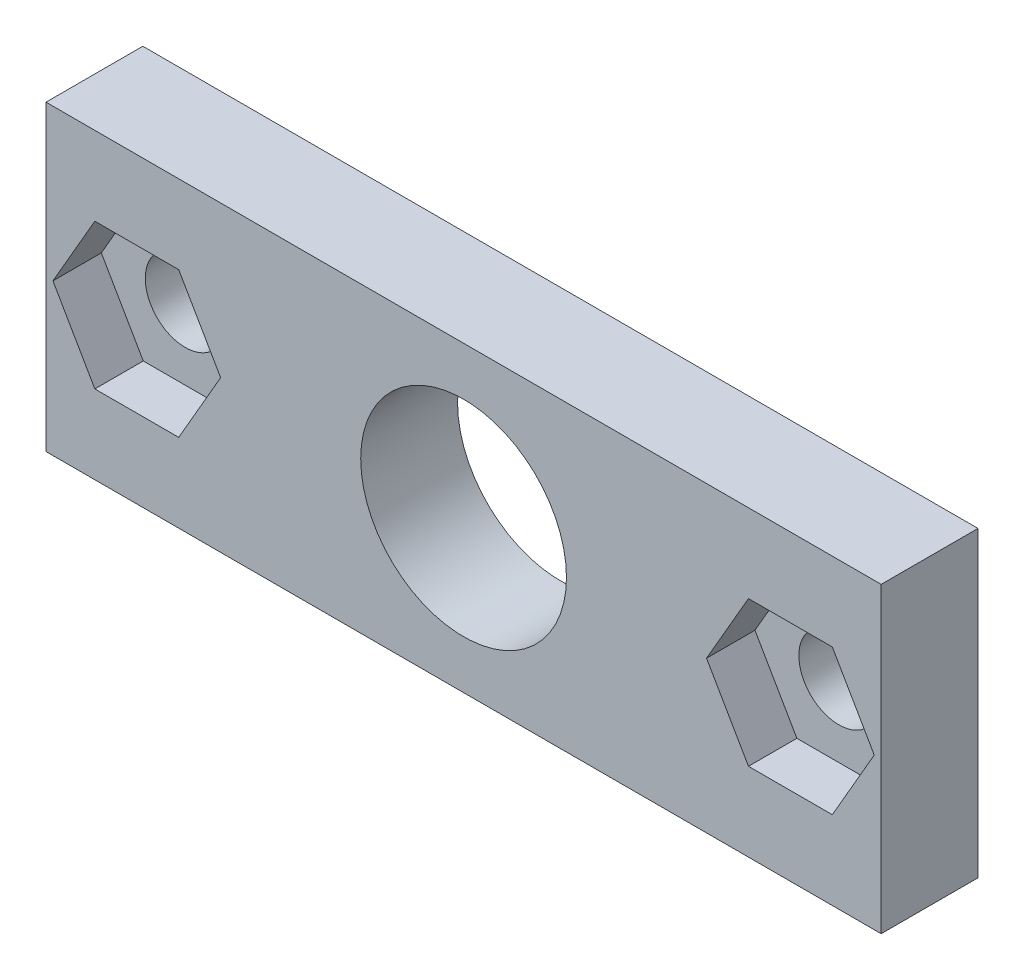
ISO-10303-21;
HEADER;
FILE_DESCRIPTION(('STEP AP214'),'2;1');
FILE_NAME('part.step','',(''),(''),'','','');
FILE_SCHEMA(('AUTOMOTIVE_DESIGN { 1 0 10303 214 1 1 1 1 }'));
ENDSEC;
DATA;
#1=APPLICATION_CONTEXT('core data for automotive mechanical design processes');
#2=APPLICATION_PROTOCOL_DEFINITION('international standard','automotive_design',2000,#1);
#3=PRODUCT_CONTEXT('',#1,'mechanical');
#4=PRODUCT('Part','Part','',(#3));
#5=PRODUCT_RELATED_PRODUCT_CATEGORY('part','',(#4));
#6=PRODUCT_DEFINITION_FORMATION('','',#4);
#7=PRODUCT_DEFINITION_CONTEXT('part definition',#1,'design');
#8=PRODUCT_DEFINITION('design','',#6,#7);
#9=PRODUCT_DEFINITION_SHAPE('','',#8);
#10=(LENGTH_UNIT() NAMED_UNIT(*) SI_UNIT(.MILLI.,.METRE.));
#11=(NAMED_UNIT(*) PLANE_ANGLE_UNIT() SI_UNIT($,.RADIAN.));
#12=(NAMED_UNIT(*) SI_UNIT($,.STERADIAN.) SOLID_ANGLE_UNIT());
#13=UNCERTAINTY_MEASURE_WITH_UNIT(LENGTH_MEASURE(1.E-05),#10,'distance_accuracy_value','');
#14=(GEOMETRIC_REPRESENTATION_CONTEXT(3) GLOBAL_UNCERTAINTY_ASSIGNED_CONTEXT((#13)) GLOBAL_UNIT_ASSIGNED_CONTEXT((#10,
#11,#12)) REPRESENTATION_CONTEXT('',''));
#15=CARTESIAN_POINT('',(0.,0.,0.));
#16=DIRECTION('',(0.,0.,1.));
#17=DIRECTION('',(1.,0.,0.));
#18=AXIS2_PLACEMENT_3D('',#15,#16,#17);
#19=CARTESIAN_POINT('',(0.,0.,0.));
#20=DIRECTION('',(0.,0.,1.));
#21=DIRECTION('',(1.,0.,0.));
#22=AXIS2_PLACEMENT_3D('',#19,#20,#21);
#23=PLANE('',#22);
#24=DIRECTION('',(0.5,0.866025403784439,0.));
#25=VECTOR('',#24,1.);
#26=CARTESIAN_POINT('',(10.9269237886466,1.54330127018903,0.));
#27=LINE('',#26,#25);
#28=CARTESIAN_POINT('',(10.0358983848622,0.,0.));
#29=VERTEX_POINT('',#28);
#30=CARTESIAN_POINT('',(11.7679491924311,3.,0.));
#31=VERTEX_POINT('',#30);
#32=EDGE_CURVE('E36',#29,#31,#27,.T.);
#33=ORIENTED_EDGE('',*,*,#32,.F.);
#34=DIRECTION('',(-0.5,0.866025403784439,0.));
#35=VECTOR('',#34,1.);
#36=CARTESIAN_POINT('',(10.9269237886466,-1.54330127018908,0.));
#37=LINE('',#36,#35);
#38=CARTESIAN_POINT('',(11.7679491924311,-3.,0.));
#39=VERTEX_POINT('',#38);
#40=EDGE_CURVE('E42',#39,#29,#37,.T.);
#41=ORIENTED_EDGE('',*,*,#40,.F.);
#42=DIRECTION('',(-1.,0.,0.));
#43=VECTOR('',#42,1.);
#44=CARTESIAN_POINT('',(8.74248366338745,-3.,0.));
#45=LINE('',#44,#43);
#46=CARTESIAN_POINT('',(15.2320508075689,-3.,0.));
#47=VERTEX_POINT('',#46);
#48=EDGE_CURVE('E257',#47,#39,#45,.T.);
#49=ORIENTED_EDGE('',*,*,#48,.F.);
#50=DIRECTION('',(-0.5,-0.866025403784439,0.));
#51=VECTOR('',#50,1.);
#52=CARTESIAN_POINT('',(16.1230762113532,-1.45669872981094,0.));
#53=LINE('',#52,#51);
#54=CARTESIAN_POINT('',(16.9641016151378,0.,0.));
#55=VERTEX_POINT('',#54);
#56=EDGE_CURVE('E253',#55,#47,#53,.T.);
#57=ORIENTED_EDGE('',*,*,#56,.F.);
#58=DIRECTION('',(0.5,-0.866025403784438,0.));
#59=VECTOR('',#58,1.);
#60=CARTESIAN_POINT('',(16.1230762113532,1.45669872981099,0.));
#61=LINE('',#60,#59);
#62=CARTESIAN_POINT('',(15.2320508075689,3.,0.));
#63=VERTEX_POINT('',#62);
#64=EDGE_CURVE('E249',#63,#55,#61,.T.);
#65=ORIENTED_EDGE('',*,*,#64,.F.);
#66=DIRECTION('',(1.,0.,0.));
#67=VECTOR('',#66,1.);
#68=CARTESIAN_POINT('',(8.19219926664872,3.,0.));
#69=LINE('',#68,#67);
#70=EDGE_CURVE('E245',#31,#63,#69,.T.);
#71=ORIENTED_EDGE('',*,*,#70,.F.);
#72=EDGE_LOOP('',(#33,#41,#49,#57,#65,#71));
#73=FACE_BOUND('',#72,.T.);
#74=CARTESIAN_POINT('',(13.5,0.,0.));
#75=DIRECTION('',(0.,0.,1.));
#76=DIRECTION('',(1.,0.,0.));
#77=AXIS2_PLACEMENT_3D('',#74,#75,#76);
#78=CIRCLE('',#77,1.65);
#79=CARTESIAN_POINT('',(15.15,0.,0.));
#80=VERTEX_POINT('',#79);
#81=EDGE_CURVE('E332',#80,#80,#78,.T.);
#82=ORIENTED_EDGE('',*,*,#81,.F.);
#83=EDGE_LOOP('',(#82));
#84=FACE_BOUND('',#83,.T.);
#85=ADVANCED_FACE('F16',(#73,#84),#23,.T.);
#86=CARTESIAN_POINT('',(0.75,6.25,-2.));
#87=DIRECTION('',(0.,-1.,0.));
#88=DIRECTION('',(0.,0.,-1.));
#89=AXIS2_PLACEMENT_3D('',#86,#87,#88);
#90=PLANE('',#89);
#91=DIRECTION('',(0.,0.,1.));
#92=VECTOR('',#91,1.);
#93=CARTESIAN_POINT('',(-17.25,6.25,-2.));
#94=LINE('',#93,#92);
#95=CARTESIAN_POINT('',(-17.25,6.25,-2.));
#96=VERTEX_POINT('',#95);
#97=CARTESIAN_POINT('',(-17.25,6.25,2.));
#98=VERTEX_POINT('',#97);
#99=EDGE_CURVE('E10',#96,#98,#94,.T.);
#100=ORIENTED_EDGE('',*,*,#99,.T.);
#101=DIRECTION('',(1.,0.,0.));
#102=VECTOR('',#101,1.);
#103=CARTESIAN_POINT('',(0.75,6.25,2.));
#104=LINE('',#103,#102);
#105=CARTESIAN_POINT('',(17.25,6.25,2.));
#106=VERTEX_POINT('',#105);
#107=EDGE_CURVE('E166',#98,#106,#104,.T.);
#108=ORIENTED_EDGE('',*,*,#107,.T.);
#109=DIRECTION('',(0.,0.,1.));
#110=VECTOR('',#109,1.);
#111=CARTESIAN_POINT('',(17.25,6.25,-2.));
#112=LINE('',#111,#110);
#113=CARTESIAN_POINT('',(17.25,6.25,-2.));
#114=VERTEX_POINT('',#113);
#115=EDGE_CURVE('E354',#114,#106,#112,.T.);
#116=ORIENTED_EDGE('',*,*,#115,.F.);
#117=DIRECTION('',(1.,0.,0.));
#118=VECTOR('',#117,1.);
#119=CARTESIAN_POINT('',(0.75,6.25,-2.));
#120=LINE('',#119,#118);
#121=EDGE_CURVE('E169',#96,#114,#120,.T.);
#122=ORIENTED_EDGE('',*,*,#121,.F.);
#123=EDGE_LOOP('',(#100,#108,#116,#122));
#124=FACE_BOUND('',#123,.T.);
#125=ADVANCED_FACE('F164',(#124),#90,.F.);
#126=CARTESIAN_POINT('',(-17.25,2.70262141749215,-2.));
#127=DIRECTION('',(-1.,0.,0.));
#128=DIRECTION('',(0.,-1.,0.));
#129=AXIS2_PLACEMENT_3D('',#126,#127,#128);
#130=PLANE('',#129);
#131=DIRECTION('',(0.,0.,1.));
#132=VECTOR('',#131,1.);
#133=CARTESIAN_POINT('',(-17.25,-6.25,-2.));
#134=LINE('',#133,#132);
#135=CARTESIAN_POINT('',(-17.25,-6.25,-2.));
#136=VERTEX_POINT('',#135);
#137=CARTESIAN_POINT('',(-17.25,-6.25,2.));
#138=VERTEX_POINT('',#137);
#139=EDGE_CURVE('E25',#136,#138,#134,.T.);
#140=ORIENTED_EDGE('',*,*,#139,.T.);
#141=DIRECTION('',(0.,-1.,0.));
#142=VECTOR('',#141,1.);
#143=CARTESIAN_POINT('',(-17.25,2.70262141749215,2.));
#144=LINE('',#143,#142);
#145=EDGE_CURVE('E174',#98,#138,#144,.T.);
#146=ORIENTED_EDGE('',*,*,#145,.F.);
#147=ORIENTED_EDGE('',*,*,#99,.F.);
#148=DIRECTION('',(0.,-1.,0.));
#149=VECTOR('',#148,1.);
#150=CARTESIAN_POINT('',(-17.25,2.70262141749215,-2.));
#151=LINE('',#150,#149);
#152=EDGE_CURVE('E335',#96,#136,#151,.T.);
#153=ORIENTED_EDGE('',*,*,#152,.T.);
#154=EDGE_LOOP('',(#140,#146,#147,#153));
#155=FACE_BOUND('',#154,.T.);
#156=ADVANCED_FACE('F175',(#155),#130,.T.);
#157=CARTESIAN_POINT('',(0.,-6.25,-2.));
#158=DIRECTION('',(0.,-1.,0.));
#159=DIRECTION('',(0.,0.,-1.));
#160=AXIS2_PLACEMENT_3D('',#157,#158,#159);
#161=PLANE('',#160);
#162=DIRECTION('',(0.,0.,1.));
#163=VECTOR('',#162,1.);
#164=CARTESIAN_POINT('',(17.25,-6.25,-2.));
#165=LINE('',#164,#163);
#166=CARTESIAN_POINT('',(17.25,-6.25,-2.));
#167=VERTEX_POINT('',#166);
#168=CARTESIAN_POINT('',(17.25,-6.25,2.));
#169=VERTEX_POINT('',#168);
#170=EDGE_CURVE('E363',#167,#169,#165,.T.);
#171=ORIENTED_EDGE('',*,*,#170,.T.);
#172=DIRECTION('',(1.,0.,0.));
#173=VECTOR('',#172,1.);
#174=CARTESIAN_POINT('',(0.,-6.25,2.));
#175=LINE('',#174,#173);
#176=EDGE_CURVE('E180',#138,#169,#175,.T.);
#177=ORIENTED_EDGE('',*,*,#176,.F.);
#178=ORIENTED_EDGE('',*,*,#139,.F.);
#179=DIRECTION('',(1.,0.,0.));
#180=VECTOR('',#179,1.);
#181=CARTESIAN_POINT('',(0.,-6.25,-2.));
#182=LINE('',#181,#180);
#183=EDGE_CURVE('E338',#136,#167,#182,.T.);
#184=ORIENTED_EDGE('',*,*,#183,.T.);
#185=EDGE_LOOP('',(#171,#177,#178,#184));
#186=FACE_BOUND('',#185,.T.);
#187=ADVANCED_FACE('F391',(#186),#161,.T.);
#188=CARTESIAN_POINT('',(0.,0.,-2.));
#189=DIRECTION('',(0.,0.,1.));
#190=DIRECTION('',(1.,0.,0.));
#191=AXIS2_PLACEMENT_3D('',#188,#189,#190);
#192=CYLINDRICAL_SURFACE('',#191,4.25);
#193=CARTESIAN_POINT('',(0.,0.,-2.));
#194=DIRECTION('',(0.,0.,1.));
#195=DIRECTION('',(1.,0.,0.));
#196=AXIS2_PLACEMENT_3D('',#193,#194,#195);
#197=CIRCLE('',#196,4.25);
#198=CARTESIAN_POINT('',(4.25,0.,-2.));
#199=VERTEX_POINT('',#198);
#200=EDGE_CURVE('E346',#199,#199,#197,.T.);
#201=ORIENTED_EDGE('',*,*,#200,.F.);
#202=EDGE_LOOP('',(#201));
#203=FACE_BOUND('',#202,.T.);
#204=CARTESIAN_POINT('',(0.,0.,2.));
#205=DIRECTION('',(0.,0.,1.));
#206=DIRECTION('',(1.,0.,0.));
#207=AXIS2_PLACEMENT_3D('',#204,#205,#206);
#208=CIRCLE('',#207,4.25);
#209=CARTESIAN_POINT('',(4.25,0.,2.));
#210=VERTEX_POINT('',#209);
#211=EDGE_CURVE('E220',#210,#210,#208,.T.);
#212=ORIENTED_EDGE('',*,*,#211,.T.);
#213=EDGE_LOOP('',(#212));
#214=FACE_BOUND('',#213,.T.);
#215=ADVANCED_FACE('F395',(#203,#214),#192,.F.);
#216=CARTESIAN_POINT('',(17.25,2.70262141749214,-2.));
#217=DIRECTION('',(-1.,0.,0.));
#218=DIRECTION('',(0.,-1.,0.));
#219=AXIS2_PLACEMENT_3D('',#216,#217,#218);
#220=PLANE('',#219);
#221=ORIENTED_EDGE('',*,*,#115,.T.);
#222=DIRECTION('',(0.,-1.,0.));
#223=VECTOR('',#222,1.);
#224=CARTESIAN_POINT('',(17.25,2.70262141749214,2.));
#225=LINE('',#224,#223);
#226=EDGE_CURVE('E185',#106,#169,#225,.T.);
#227=ORIENTED_EDGE('',*,*,#226,.T.);
#228=ORIENTED_EDGE('',*,*,#170,.F.);
#229=DIRECTION('',(0.,-1.,0.));
#230=VECTOR('',#229,1.);
#231=CARTESIAN_POINT('',(17.25,2.70262141749214,-2.));
#232=LINE('',#231,#230);
#233=EDGE_CURVE('E342',#114,#167,#232,.T.);
#234=ORIENTED_EDGE('',*,*,#233,.F.);
#235=EDGE_LOOP('',(#221,#227,#228,#234));
#236=FACE_BOUND('',#235,.T.);
#237=ADVANCED_FACE('F404',(#236),#220,.F.);
#238=CARTESIAN_POINT('',(-13.5,0.,-2.));
#239=DIRECTION('',(0.,0.,1.));
#240=DIRECTION('',(1.,0.,0.));
#241=AXIS2_PLACEMENT_3D('',#238,#239,#240);
#242=CYLINDRICAL_SURFACE('',#241,1.65);
#243=CARTESIAN_POINT('',(-13.5,0.,-2.));
#244=DIRECTION('',(0.,0.,1.));
#245=DIRECTION('',(1.,0.,0.));
#246=AXIS2_PLACEMENT_3D('',#243,#244,#245);
#247=CIRCLE('',#246,1.65);
#248=CARTESIAN_POINT('',(-11.85,0.,-2.));
#249=VERTEX_POINT('',#248);
#250=EDGE_CURVE('E328',#249,#249,#247,.T.);
#251=ORIENTED_EDGE('',*,*,#250,.F.);
#252=EDGE_LOOP('',(#251));
#253=FACE_BOUND('',#252,.T.);
#254=CARTESIAN_POINT('',(-13.5,0.,0.));
#255=DIRECTION('',(0.,0.,1.));
#256=DIRECTION('',(1.,0.,0.));
#257=AXIS2_PLACEMENT_3D('',#254,#255,#256);
#258=CIRCLE('',#257,1.65);
#259=CARTESIAN_POINT('',(-11.85,0.,0.));
#260=VERTEX_POINT('',#259);
#261=EDGE_CURVE('E306',#260,#260,#258,.T.);
#262=ORIENTED_EDGE('',*,*,#261,.T.);
#263=EDGE_LOOP('',(#262));
#264=FACE_BOUND('',#263,.T.);
#265=ADVANCED_FACE('F18',(#253,#264),#242,.F.);
#266=CARTESIAN_POINT('',(13.5,0.,-2.));
#267=DIRECTION('',(0.,0.,1.));
#268=DIRECTION('',(1.,0.,0.));
#269=AXIS2_PLACEMENT_3D('',#266,#267,#268);
#270=CYLINDRICAL_SURFACE('',#269,1.65);
#271=CARTESIAN_POINT('',(13.5,0.,-2.));
#272=DIRECTION('',(0.,0.,1.));
#273=DIRECTION('',(1.,0.,0.));
#274=AXIS2_PLACEMENT_3D('',#271,#272,#273);
#275=CIRCLE('',#274,1.65);
#276=CARTESIAN_POINT('',(15.15,0.,-2.));
#277=VERTEX_POINT('',#276);
#278=EDGE_CURVE('E350',#277,#277,#275,.T.);
#279=ORIENTED_EDGE('',*,*,#278,.F.);
#280=EDGE_LOOP('',(#279));
#281=FACE_BOUND('',#280,.T.);
#282=ORIENTED_EDGE('',*,*,#81,.T.);
#283=EDGE_LOOP('',(#282));
#284=FACE_BOUND('',#283,.T.);
#285=ADVANCED_FACE('F435',(#281,#284),#270,.F.);
#286=CARTESIAN_POINT('',(0.,0.,-2.));
#287=DIRECTION('',(0.,0.,1.));
#288=DIRECTION('',(1.,0.,0.));
#289=AXIS2_PLACEMENT_3D('',#286,#287,#288);
#290=PLANE('',#289);
#291=ORIENTED_EDGE('',*,*,#250,.T.);
#292=EDGE_LOOP('',(#291));
#293=FACE_BOUND('',#292,.T.);
#294=ORIENTED_EDGE('',*,*,#121,.T.);
#295=ORIENTED_EDGE('',*,*,#233,.T.);
#296=ORIENTED_EDGE('',*,*,#183,.F.);
#297=ORIENTED_EDGE('',*,*,#152,.F.);
#298=EDGE_LOOP('',(#294,#295,#296,#297));
#299=FACE_BOUND('',#298,.T.);
#300=ORIENTED_EDGE('',*,*,#200,.T.);
#301=EDGE_LOOP('',(#300));
#302=FACE_BOUND('',#301,.T.);
#303=ORIENTED_EDGE('',*,*,#278,.T.);
#304=EDGE_LOOP('',(#303));
#305=FACE_BOUND('',#304,.T.);
#306=ADVANCED_FACE('F422',(#293,#299,#302,#305),#290,.F.);
#307=DIRECTION('',(0.5,0.866025403784439,0.));
#308=VECTOR('',#307,1.);
#309=CARTESIAN_POINT('',(-16.0980762113533,1.5,0.));
#310=LINE('',#309,#308);
#311=CARTESIAN_POINT('',(-16.9641016151378,0.,0.));
#312=VERTEX_POINT('',#311);
#313=CARTESIAN_POINT('',(-15.2320508075689,3.,0.));
#314=VERTEX_POINT('',#313);
#315=EDGE_CURVE('E262',#312,#314,#310,.T.);
#316=ORIENTED_EDGE('',*,*,#315,.F.);
#317=DIRECTION('',(-0.5,0.866025403784438,0.));
#318=VECTOR('',#317,1.);
#319=CARTESIAN_POINT('',(-15.0934471443671,-3.24006858678076,0.));
#320=LINE('',#319,#318);
#321=CARTESIAN_POINT('',(-15.2320508075689,-3.,0.));
#322=VERTEX_POINT('',#321);
#323=EDGE_CURVE('E187',#322,#312,#320,.T.);
#324=ORIENTED_EDGE('',*,*,#323,.F.);
#325=DIRECTION('',(-1.,0.,0.));
#326=VECTOR('',#325,1.);
#327=CARTESIAN_POINT('',(-13.4,-3.,0.));
#328=LINE('',#327,#326);
#329=CARTESIAN_POINT('',(-11.7679491924311,-3.,0.));
#330=VERTEX_POINT('',#329);
#331=EDGE_CURVE('E194',#330,#322,#328,.T.);
#332=ORIENTED_EDGE('',*,*,#331,.F.);
#333=DIRECTION('',(-0.5,-0.866025403784439,0.));
#334=VECTOR('',#333,1.);
#335=CARTESIAN_POINT('',(-9.89729472166041,0.240068586780754,0.));
#336=LINE('',#335,#334);
#337=CARTESIAN_POINT('',(-10.0358983848622,0.,0.));
#338=VERTEX_POINT('',#337);
#339=EDGE_CURVE('E274',#338,#330,#336,.T.);
#340=ORIENTED_EDGE('',*,*,#339,.F.);
#341=DIRECTION('',(0.5,-0.866025403784438,0.));
#342=VECTOR('',#341,1.);
#343=CARTESIAN_POINT('',(-10.9019237886467,1.5,0.));
#344=LINE('',#343,#342);
#345=CARTESIAN_POINT('',(-11.7679491924311,3.,0.));
#346=VERTEX_POINT('',#345);
#347=EDGE_CURVE('E270',#346,#338,#344,.T.);
#348=ORIENTED_EDGE('',*,*,#347,.F.);
#349=DIRECTION('',(1.,0.,0.));
#350=VECTOR('',#349,1.);
#351=CARTESIAN_POINT('',(-13.5,3.,0.));
#352=LINE('',#351,#350);
#353=EDGE_CURVE('E266',#314,#346,#352,.T.);
#354=ORIENTED_EDGE('',*,*,#353,.F.);
#355=EDGE_LOOP('',(#316,#324,#332,#340,#348,#354));
#356=FACE_BOUND('',#355,.T.);
#357=ORIENTED_EDGE('',*,*,#261,.F.);
#358=EDGE_LOOP('',(#357));
#359=FACE_BOUND('',#358,.T.);
#360=ADVANCED_FACE('F417',(#356,#359),#23,.T.);
#361=CARTESIAN_POINT('',(-16.0980762113533,1.5,2.));
#362=DIRECTION('',(-0.866025403784439,0.5,0.));
#363=DIRECTION('',(-0.5,-0.866025403784439,0.));
#364=AXIS2_PLACEMENT_3D('',#361,#362,#363);
#365=PLANE('',#364);
#366=ORIENTED_EDGE('',*,*,#315,.T.);
#367=DIRECTION('',(0.,0.,-1.));
#368=VECTOR('',#367,1.);
#369=CARTESIAN_POINT('',(-15.2320508075689,3.,2.));
#370=LINE('',#369,#368);
#371=CARTESIAN_POINT('',(-15.2320508075689,3.,2.));
#372=VERTEX_POINT('',#371);
#373=EDGE_CURVE('E302',#372,#314,#370,.T.);
#374=ORIENTED_EDGE('',*,*,#373,.F.);
#375=DIRECTION('',(0.5,0.866025403784439,0.));
#376=VECTOR('',#375,1.);
#377=CARTESIAN_POINT('',(-16.0980762113533,1.5,2.));
#378=LINE('',#377,#376);
#379=CARTESIAN_POINT('',(-16.9641016151378,0.,2.));
#380=VERTEX_POINT('',#379);
#381=EDGE_CURVE('E223',#380,#372,#378,.T.);
#382=ORIENTED_EDGE('',*,*,#381,.F.);
#383=DIRECTION('',(0.,0.,-1.));
#384=VECTOR('',#383,1.);
#385=CARTESIAN_POINT('',(-16.9641016151378,0.,2.));
#386=LINE('',#385,#384);
#387=EDGE_CURVE('E281',#380,#312,#386,.T.);
#388=ORIENTED_EDGE('',*,*,#387,.T.);
#389=EDGE_LOOP('',(#366,#374,#382,#388));
#390=FACE_BOUND('',#389,.T.);
#391=ADVANCED_FACE('F421',(#390),#365,.F.);
#392=CARTESIAN_POINT('',(-13.5,3.,2.));
#393=DIRECTION('',(0.,1.,0.));
#394=DIRECTION('',(-1.,0.,0.));
#395=AXIS2_PLACEMENT_3D('',#392,#393,#394);
#396=PLANE('',#395);
#397=ORIENTED_EDGE('',*,*,#353,.T.);
#398=DIRECTION('',(0.,0.,-1.));
#399=VECTOR('',#398,1.);
#400=CARTESIAN_POINT('',(-11.7679491924311,3.,2.));
#401=LINE('',#400,#399);
#402=CARTESIAN_POINT('',(-11.7679491924311,3.,2.));
#403=VERTEX_POINT('',#402);
#404=EDGE_CURVE('E298',#403,#346,#401,.T.);
#405=ORIENTED_EDGE('',*,*,#404,.F.);
#406=DIRECTION('',(1.,0.,0.));
#407=VECTOR('',#406,1.);
#408=CARTESIAN_POINT('',(-13.5,3.,2.));
#409=LINE('',#408,#407);
#410=EDGE_CURVE('E227',#372,#403,#409,.T.);
#411=ORIENTED_EDGE('',*,*,#410,.F.);
#412=ORIENTED_EDGE('',*,*,#373,.T.);
#413=EDGE_LOOP('',(#397,#405,#411,#412));
#414=FACE_BOUND('',#413,.T.);
#415=ADVANCED_FACE('F469',(#414),#396,.F.);
#416=CARTESIAN_POINT('',(-10.9019237886467,1.5,2.));
#417=DIRECTION('',(0.866025403784438,0.5,0.));
#418=DIRECTION('',(-0.5,0.866025403784438,0.));
#419=AXIS2_PLACEMENT_3D('',#416,#417,#418);
#420=PLANE('',#419);
#421=ORIENTED_EDGE('',*,*,#347,.T.);
#422=DIRECTION('',(0.,0.,-1.));
#423=VECTOR('',#422,1.);
#424=CARTESIAN_POINT('',(-10.0358983848622,0.,2.));
#425=LINE('',#424,#423);
#426=CARTESIAN_POINT('',(-10.0358983848622,0.,2.));
#427=VERTEX_POINT('',#426);
#428=EDGE_CURVE('E294',#427,#338,#425,.T.);
#429=ORIENTED_EDGE('',*,*,#428,.F.);
#430=DIRECTION('',(0.5,-0.866025403784438,0.));
#431=VECTOR('',#430,1.);
#432=CARTESIAN_POINT('',(-10.9019237886467,1.5,2.));
#433=LINE('',#432,#431);
#434=EDGE_CURVE('E230',#403,#427,#433,.T.);
#435=ORIENTED_EDGE('',*,*,#434,.F.);
#436=ORIENTED_EDGE('',*,*,#404,.T.);
#437=EDGE_LOOP('',(#421,#429,#435,#436));
#438=FACE_BOUND('',#437,.T.);
#439=ADVANCED_FACE('F473',(#438),#420,.F.);
#440=CARTESIAN_POINT('',(-9.89729472166041,0.240068586780754,2.));
#441=DIRECTION('',(0.866025403784439,-0.5,0.));
#442=DIRECTION('',(0.5,0.866025403784439,0.));
#443=AXIS2_PLACEMENT_3D('',#440,#441,#442);
#444=PLANE('',#443);
#445=ORIENTED_EDGE('',*,*,#339,.T.);
#446=DIRECTION('',(0.,0.,-1.));
#447=VECTOR('',#446,1.);
#448=CARTESIAN_POINT('',(-11.7679491924311,-3.,2.));
#449=LINE('',#448,#447);
#450=CARTESIAN_POINT('',(-11.7679491924311,-3.,2.));
#451=VERTEX_POINT('',#450);
#452=EDGE_CURVE('E290',#451,#330,#449,.T.);
#453=ORIENTED_EDGE('',*,*,#452,.F.);
#454=DIRECTION('',(-0.5,-0.866025403784439,0.));
#455=VECTOR('',#454,1.);
#456=CARTESIAN_POINT('',(-9.89729472166041,0.240068586780754,2.));
#457=LINE('',#456,#455);
#458=EDGE_CURVE('E233',#427,#451,#457,.T.);
#459=ORIENTED_EDGE('',*,*,#458,.F.);
#460=ORIENTED_EDGE('',*,*,#428,.T.);
#461=EDGE_LOOP('',(#445,#453,#459,#460));
#462=FACE_BOUND('',#461,.T.);
#463=ADVANCED_FACE('F479',(#462),#444,.F.);
#464=CARTESIAN_POINT('',(-13.4,-3.,2.));
#465=DIRECTION('',(0.,-1.,0.));
#466=DIRECTION('',(1.,0.,0.));
#467=AXIS2_PLACEMENT_3D('',#464,#465,#466);
#468=PLANE('',#467);
#469=ORIENTED_EDGE('',*,*,#331,.T.);
#470=DIRECTION('',(0.,0.,-1.));
#471=VECTOR('',#470,1.);
#472=CARTESIAN_POINT('',(-15.2320508075689,-3.,2.));
#473=LINE('',#472,#471);
#474=CARTESIAN_POINT('',(-15.2320508075689,-3.,2.));
#475=VERTEX_POINT('',#474);
#476=EDGE_CURVE('E285',#475,#322,#473,.T.);
#477=ORIENTED_EDGE('',*,*,#476,.F.);
#478=DIRECTION('',(-1.,0.,0.));
#479=VECTOR('',#478,1.);
#480=CARTESIAN_POINT('',(-13.4,-3.,2.));
#481=LINE('',#480,#479);
#482=EDGE_CURVE('E236',#451,#475,#481,.T.);
#483=ORIENTED_EDGE('',*,*,#482,.F.);
#484=ORIENTED_EDGE('',*,*,#452,.T.);
#485=EDGE_LOOP('',(#469,#477,#483,#484));
#486=FACE_BOUND('',#485,.T.);
#487=ADVANCED_FACE('F481',(#486),#468,.F.);
#488=CARTESIAN_POINT('',(10.9269237886466,1.54330127018903,2.));
#489=DIRECTION('',(-0.866025403784439,0.5,0.));
#490=DIRECTION('',(-0.5,-0.866025403784439,0.));
#491=AXIS2_PLACEMENT_3D('',#488,#489,#490);
#492=PLANE('',#491);
#493=ORIENTED_EDGE('',*,*,#32,.T.);
#494=DIRECTION('',(0.,0.,-1.));
#495=VECTOR('',#494,1.);
#496=CARTESIAN_POINT('',(11.7679491924311,3.,2.));
#497=LINE('',#496,#495);
#498=CARTESIAN_POINT('',(11.7679491924311,3.,2.));
#499=VERTEX_POINT('',#498);
#500=EDGE_CURVE('E286',#499,#31,#497,.T.);
#501=ORIENTED_EDGE('',*,*,#500,.F.);
#502=DIRECTION('',(0.5,0.866025403784439,0.));
#503=VECTOR('',#502,1.);
#504=CARTESIAN_POINT('',(10.9269237886466,1.54330127018903,2.));
#505=LINE('',#504,#503);
#506=CARTESIAN_POINT('',(10.0358983848622,0.,2.));
#507=VERTEX_POINT('',#506);
#508=EDGE_CURVE('E201',#507,#499,#505,.T.);
#509=ORIENTED_EDGE('',*,*,#508,.F.);
#510=DIRECTION('',(0.,0.,-1.));
#511=VECTOR('',#510,1.);
#512=CARTESIAN_POINT('',(10.0358983848622,0.,2.));
#513=LINE('',#512,#511);
#514=EDGE_CURVE('E242',#507,#29,#513,.T.);
#515=ORIENTED_EDGE('',*,*,#514,.T.);
#516=EDGE_LOOP('',(#493,#501,#509,#515));
#517=FACE_BOUND('',#516,.T.);
#518=ADVANCED_FACE('F495',(#517),#492,.F.);
#519=CARTESIAN_POINT('',(8.19219926664872,3.,2.));
#520=DIRECTION('',(0.,1.,0.));
#521=DIRECTION('',(-1.,0.,0.));
#522=AXIS2_PLACEMENT_3D('',#519,#520,#521);
#523=PLANE('',#522);
#524=ORIENTED_EDGE('',*,*,#70,.T.);
#525=DIRECTION('',(0.,0.,-1.));
#526=VECTOR('',#525,1.);
#527=CARTESIAN_POINT('',(15.2320508075689,3.,2.));
#528=LINE('',#527,#526);
#529=CARTESIAN_POINT('',(15.2320508075689,3.,2.));
#530=VERTEX_POINT('',#529);
#531=EDGE_CURVE('E321',#530,#63,#528,.T.);
#532=ORIENTED_EDGE('',*,*,#531,.F.);
#533=DIRECTION('',(1.,0.,0.));
#534=VECTOR('',#533,1.);
#535=CARTESIAN_POINT('',(8.19219926664872,3.,2.));
#536=LINE('',#535,#534);
#537=EDGE_CURVE('E205',#499,#530,#536,.T.);
#538=ORIENTED_EDGE('',*,*,#537,.F.);
#539=ORIENTED_EDGE('',*,*,#500,.T.);
#540=EDGE_LOOP('',(#524,#532,#538,#539));
#541=FACE_BOUND('',#540,.T.);
#542=ADVANCED_FACE('F513',(#541),#523,.F.);
#543=CARTESIAN_POINT('',(16.1230762113532,1.45669872981099,2.));
#544=DIRECTION('',(0.866025403784438,0.5,0.));
#545=DIRECTION('',(-0.5,0.866025403784438,0.));
#546=AXIS2_PLACEMENT_3D('',#543,#544,#545);
#547=PLANE('',#546);
#548=ORIENTED_EDGE('',*,*,#64,.T.);
#549=DIRECTION('',(0.,0.,-1.));
#550=VECTOR('',#549,1.);
#551=CARTESIAN_POINT('',(16.9641016151378,0.,2.));
#552=LINE('',#551,#550);
#553=CARTESIAN_POINT('',(16.9641016151378,0.,2.));
#554=VERTEX_POINT('',#553);
#555=EDGE_CURVE('E317',#554,#55,#552,.T.);
#556=ORIENTED_EDGE('',*,*,#555,.F.);
#557=DIRECTION('',(0.5,-0.866025403784438,0.));
#558=VECTOR('',#557,1.);
#559=CARTESIAN_POINT('',(16.1230762113532,1.45669872981099,2.));
#560=LINE('',#559,#558);
#561=EDGE_CURVE('E208',#530,#554,#560,.T.);
#562=ORIENTED_EDGE('',*,*,#561,.F.);
#563=ORIENTED_EDGE('',*,*,#531,.T.);
#564=EDGE_LOOP('',(#548,#556,#562,#563));
#565=FACE_BOUND('',#564,.T.);
#566=ADVANCED_FACE('F509',(#565),#547,.F.);
#567=CARTESIAN_POINT('',(16.1230762113532,-1.45669872981094,2.));
#568=DIRECTION('',(0.866025403784439,-0.5,0.));
#569=DIRECTION('',(0.5,0.866025403784439,0.));
#570=AXIS2_PLACEMENT_3D('',#567,#568,#569);
#571=PLANE('',#570);
#572=ORIENTED_EDGE('',*,*,#56,.T.);
#573=DIRECTION('',(0.,0.,-1.));
#574=VECTOR('',#573,1.);
#575=CARTESIAN_POINT('',(15.2320508075689,-3.,2.));
#576=LINE('',#575,#574);
#577=CARTESIAN_POINT('',(15.2320508075689,-3.,2.));
#578=VERTEX_POINT('',#577);
#579=EDGE_CURVE('E314',#578,#47,#576,.T.);
#580=ORIENTED_EDGE('',*,*,#579,.F.);
#581=DIRECTION('',(-0.5,-0.866025403784439,0.));
#582=VECTOR('',#581,1.);
#583=CARTESIAN_POINT('',(16.1230762113532,-1.45669872981094,2.));
#584=LINE('',#583,#582);
#585=EDGE_CURVE('E211',#554,#578,#584,.T.);
#586=ORIENTED_EDGE('',*,*,#585,.F.);
#587=ORIENTED_EDGE('',*,*,#555,.T.);
#588=EDGE_LOOP('',(#572,#580,#586,#587));
#589=FACE_BOUND('',#588,.T.);
#590=ADVANCED_FACE('F505',(#589),#571,.F.);
#591=CARTESIAN_POINT('',(8.74248366338745,-3.,2.));
#592=DIRECTION('',(0.,-1.,0.));
#593=DIRECTION('',(1.,0.,0.));
#594=AXIS2_PLACEMENT_3D('',#591,#592,#593);
#595=PLANE('',#594);
#596=ORIENTED_EDGE('',*,*,#48,.T.);
#597=DIRECTION('',(0.,0.,-1.));
#598=VECTOR('',#597,1.);
#599=CARTESIAN_POINT('',(11.7679491924311,-3.,2.));
#600=LINE('',#599,#598);
#601=CARTESIAN_POINT('',(11.7679491924311,-3.,2.));
#602=VERTEX_POINT('',#601);
#603=EDGE_CURVE('E310',#602,#39,#600,.T.);
#604=ORIENTED_EDGE('',*,*,#603,.F.);
#605=DIRECTION('',(-1.,0.,0.));
#606=VECTOR('',#605,1.);
#607=CARTESIAN_POINT('',(8.74248366338745,-3.,2.));
#608=LINE('',#607,#606);
#609=EDGE_CURVE('E214',#578,#602,#608,.T.);
#610=ORIENTED_EDGE('',*,*,#609,.F.);
#611=ORIENTED_EDGE('',*,*,#579,.T.);
#612=EDGE_LOOP('',(#596,#604,#610,#611));
#613=FACE_BOUND('',#612,.T.);
#614=ADVANCED_FACE('F489',(#613),#595,.F.);
#615=CARTESIAN_POINT('',(10.9269237886466,-1.54330127018908,2.));
#616=DIRECTION('',(-0.866025403784439,-0.5,0.));
#617=DIRECTION('',(0.5,-0.866025403784439,0.));
#618=AXIS2_PLACEMENT_3D('',#615,#616,#617);
#619=PLANE('',#618);
#620=ORIENTED_EDGE('',*,*,#40,.T.);
#621=ORIENTED_EDGE('',*,*,#514,.F.);
#622=DIRECTION('',(-0.5,0.866025403784439,0.));
#623=VECTOR('',#622,1.);
#624=CARTESIAN_POINT('',(10.9269237886466,-1.54330127018908,2.));
#625=LINE('',#624,#623);
#626=EDGE_CURVE('E217',#602,#507,#625,.T.);
#627=ORIENTED_EDGE('',*,*,#626,.F.);
#628=ORIENTED_EDGE('',*,*,#603,.T.);
#629=EDGE_LOOP('',(#620,#621,#627,#628));
#630=FACE_BOUND('',#629,.T.);
#631=ADVANCED_FACE('F484',(#630),#619,.F.);
#632=CARTESIAN_POINT('',(-15.0934471443671,-3.24006858678076,2.));
#633=DIRECTION('',(-0.866025403784438,-0.5,0.));
#634=DIRECTION('',(0.5,-0.866025403784438,0.));
#635=AXIS2_PLACEMENT_3D('',#632,#633,#634);
#636=PLANE('',#635);
#637=ORIENTED_EDGE('',*,*,#323,.T.);
#638=ORIENTED_EDGE('',*,*,#387,.F.);
#639=DIRECTION('',(-0.5,0.866025403784438,0.));
#640=VECTOR('',#639,1.);
#641=CARTESIAN_POINT('',(-15.0934471443671,-3.24006858678076,2.));
#642=LINE('',#641,#640);
#643=EDGE_CURVE('E239',#475,#380,#642,.T.);
#644=ORIENTED_EDGE('',*,*,#643,.F.);
#645=ORIENTED_EDGE('',*,*,#476,.T.);
#646=EDGE_LOOP('',(#637,#638,#644,#645));
#647=FACE_BOUND('',#646,.T.);
#648=ADVANCED_FACE('F460',(#647),#636,.F.);
#649=CARTESIAN_POINT('',(0.,0.,2.));
#650=DIRECTION('',(0.,0.,1.));
#651=DIRECTION('',(1.,0.,0.));
#652=AXIS2_PLACEMENT_3D('',#649,#650,#651);
#653=PLANE('',#652);
#654=ORIENTED_EDGE('',*,*,#107,.F.);
#655=ORIENTED_EDGE('',*,*,#145,.T.);
#656=ORIENTED_EDGE('',*,*,#176,.T.);
#657=ORIENTED_EDGE('',*,*,#226,.F.);
#658=EDGE_LOOP('',(#654,#655,#656,#657));
#659=FACE_BOUND('',#658,.T.);
#660=ORIENTED_EDGE('',*,*,#508,.T.);
#661=ORIENTED_EDGE('',*,*,#537,.T.);
#662=ORIENTED_EDGE('',*,*,#561,.T.);
#663=ORIENTED_EDGE('',*,*,#585,.T.);
#664=ORIENTED_EDGE('',*,*,#609,.T.);
#665=ORIENTED_EDGE('',*,*,#626,.T.);
#666=EDGE_LOOP('',(#660,#661,#662,#663,#664,#665));
#667=FACE_BOUND('',#666,.T.);
#668=ORIENTED_EDGE('',*,*,#211,.F.);
#669=EDGE_LOOP('',(#668));
#670=FACE_BOUND('',#669,.T.);
#671=ORIENTED_EDGE('',*,*,#381,.T.);
#672=ORIENTED_EDGE('',*,*,#410,.T.);
#673=ORIENTED_EDGE('',*,*,#434,.T.);
#674=ORIENTED_EDGE('',*,*,#458,.T.);
#675=ORIENTED_EDGE('',*,*,#482,.T.);
#676=ORIENTED_EDGE('',*,*,#643,.T.);
#677=EDGE_LOOP('',(#671,#672,#673,#674,#675,#676));
#678=FACE_BOUND('',#677,.T.);
#679=ADVANCED_FACE('F182',(#659,#667,#670,#678),#653,.T.);
#680=CLOSED_SHELL('',(#85,#125,#156,#187,#215,#237,#265,#285,#306,#360,#391,#415,#439,#463,#487,
#518,#542,#566,#590,#614,#631,#648,#679));
#681=MANIFOLD_SOLID_BREP('B1',#680);
#682=ADVANCED_BREP_SHAPE_REPRESENTATION('',(#18,#681),#14);
#683=SHAPE_DEFINITION_REPRESENTATION(#9,#682);
ENDSEC;
END-ISO-10303-21;
